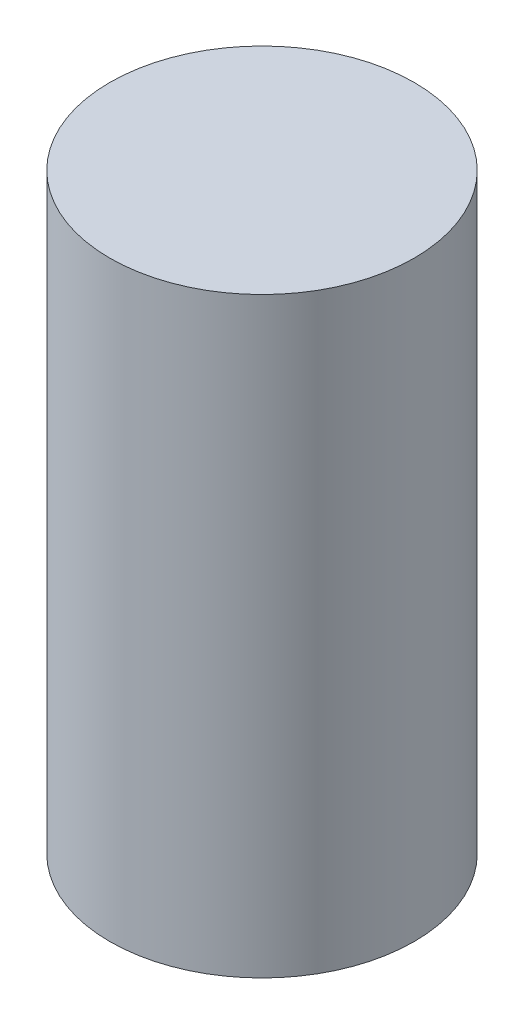
ISO-10303-21;
HEADER;
FILE_DESCRIPTION(('STEP AP214'),'2;1');
FILE_NAME('part.step','',(''),(''),'','','');
FILE_SCHEMA(('AUTOMOTIVE_DESIGN { 1 0 10303 214 1 1 1 1 }'));
ENDSEC;
DATA;
#1=APPLICATION_CONTEXT('core data for automotive mechanical design processes');
#2=APPLICATION_PROTOCOL_DEFINITION('international standard','automotive_design',2000,#1);
#3=PRODUCT_CONTEXT('',#1,'mechanical');
#4=PRODUCT('Part','Part','',(#3));
#5=PRODUCT_RELATED_PRODUCT_CATEGORY('part','',(#4));
#6=PRODUCT_DEFINITION_FORMATION('','',#4);
#7=PRODUCT_DEFINITION_CONTEXT('part definition',#1,'design');
#8=PRODUCT_DEFINITION('design','',#6,#7);
#9=PRODUCT_DEFINITION_SHAPE('','',#8);
#10=(LENGTH_UNIT() NAMED_UNIT(*) SI_UNIT(.MILLI.,.METRE.));
#11=(NAMED_UNIT(*) PLANE_ANGLE_UNIT() SI_UNIT($,.RADIAN.));
#12=(NAMED_UNIT(*) SI_UNIT($,.STERADIAN.) SOLID_ANGLE_UNIT());
#13=UNCERTAINTY_MEASURE_WITH_UNIT(LENGTH_MEASURE(1.E-05),#10,'distance_accuracy_value','');
#14=(GEOMETRIC_REPRESENTATION_CONTEXT(3) GLOBAL_UNCERTAINTY_ASSIGNED_CONTEXT((#13)) GLOBAL_UNIT_ASSIGNED_CONTEXT((#10,
#11,#12)) REPRESENTATION_CONTEXT('',''));
#15=CARTESIAN_POINT('',(0.,0.,0.));
#16=DIRECTION('',(0.,0.,1.));
#17=DIRECTION('',(1.,0.,0.));
#18=AXIS2_PLACEMENT_3D('',#15,#16,#17);
#19=CARTESIAN_POINT('',(0.,140.,0.));
#20=DIRECTION('',(0.,-1.,0.));
#21=DIRECTION('',(0.,0.,-1.));
#22=AXIS2_PLACEMENT_3D('',#19,#20,#21);
#23=CYLINDRICAL_SURFACE('',#22,36.);
#24=CARTESIAN_POINT('',(0.,140.,0.));
#25=DIRECTION('',(0.,1.,0.));
#26=DIRECTION('',(0.,0.,1.));
#27=AXIS2_PLACEMENT_3D('',#24,#25,#26);
#28=CIRCLE('',#27,36.);
#29=CARTESIAN_POINT('',(0.,140.,36.));
#30=VERTEX_POINT('',#29);
#31=EDGE_CURVE('E10',#30,#30,#28,.T.);
#32=ORIENTED_EDGE('',*,*,#31,.F.);
#33=EDGE_LOOP('',(#32));
#34=FACE_BOUND('',#33,.T.);
#35=CARTESIAN_POINT('',(0.,0.,0.));
#36=DIRECTION('',(0.,1.,0.));
#37=DIRECTION('',(0.,0.,1.));
#38=AXIS2_PLACEMENT_3D('',#35,#36,#37);
#39=CIRCLE('',#38,36.);
#40=CARTESIAN_POINT('',(0.,0.,36.));
#41=VERTEX_POINT('',#40);
#42=EDGE_CURVE('E36',#41,#41,#39,.T.);
#43=ORIENTED_EDGE('',*,*,#42,.T.);
#44=EDGE_LOOP('',(#43));
#45=FACE_BOUND('',#44,.T.);
#46=ADVANCED_FACE('F33',(#34,#45),#23,.T.);
#47=CARTESIAN_POINT('',(0.,140.,0.));
#48=DIRECTION('',(0.,1.,0.));
#49=DIRECTION('',(0.,0.,1.));
#50=AXIS2_PLACEMENT_3D('',#47,#48,#49);
#51=PLANE('',#50);
#52=ORIENTED_EDGE('',*,*,#31,.T.);
#53=EDGE_LOOP('',(#52));
#54=FACE_BOUND('',#53,.T.);
#55=ADVANCED_FACE('F48',(#54),#51,.T.);
#56=CARTESIAN_POINT('',(0.,0.,0.));
#57=DIRECTION('',(0.,1.,0.));
#58=DIRECTION('',(0.,0.,1.));
#59=AXIS2_PLACEMENT_3D('',#56,#57,#58);
#60=PLANE('',#59);
#61=ORIENTED_EDGE('',*,*,#42,.F.);
#62=EDGE_LOOP('',(#61));
#63=FACE_BOUND('',#62,.T.);
#64=ADVANCED_FACE('F46',(#63),#60,.F.);
#65=CLOSED_SHELL('',(#46,#55,#64));
#66=MANIFOLD_SOLID_BREP('B2',#65);
#67=ADVANCED_BREP_SHAPE_REPRESENTATION('',(#18,#66),#14);
#68=SHAPE_DEFINITION_REPRESENTATION(#9,#67);
ENDSEC;
END-ISO-10303-21;
